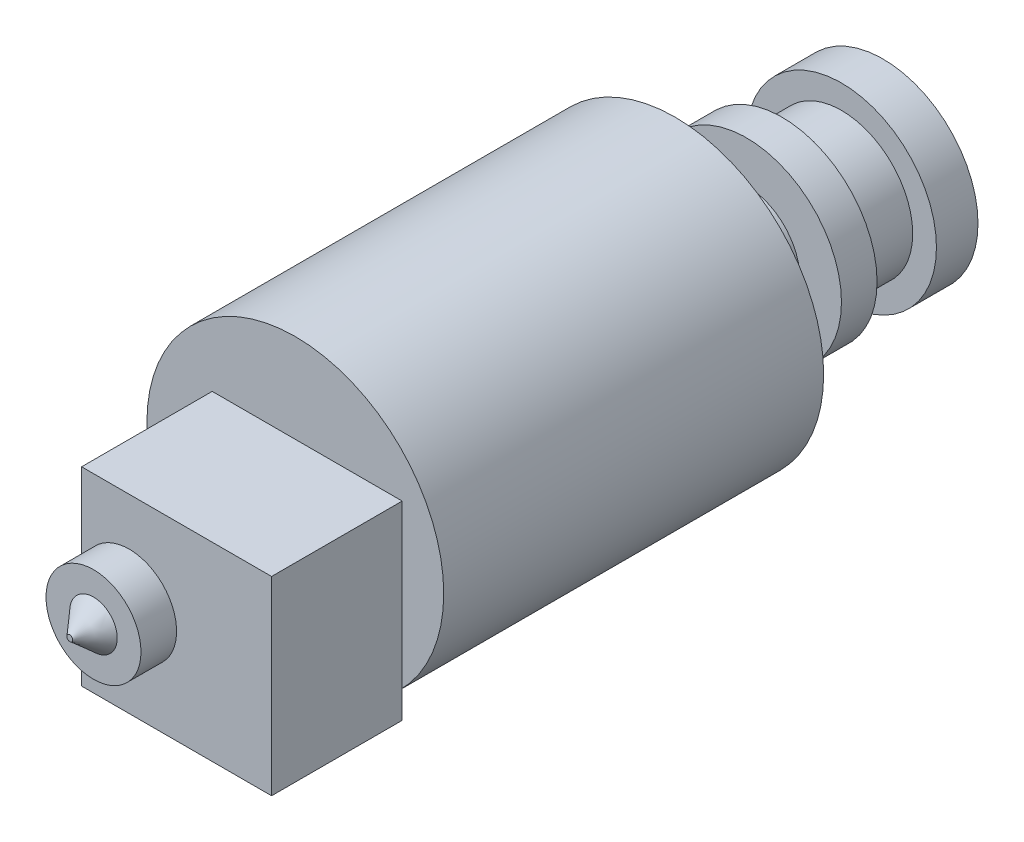
ISO-10303-21;
HEADER;
FILE_DESCRIPTION(('STEP AP214'),'2;1');
FILE_NAME('part.step','',(''),(''),'','','');
FILE_SCHEMA(('AUTOMOTIVE_DESIGN { 1 0 10303 214 1 1 1 1 }'));
ENDSEC;
DATA;
#1=APPLICATION_CONTEXT('core data for automotive mechanical design processes');
#2=APPLICATION_PROTOCOL_DEFINITION('international standard','automotive_design',2000,#1);
#3=PRODUCT_CONTEXT('',#1,'mechanical');
#4=PRODUCT('Part','Part','',(#3));
#5=PRODUCT_RELATED_PRODUCT_CATEGORY('part','',(#4));
#6=PRODUCT_DEFINITION_FORMATION('','',#4);
#7=PRODUCT_DEFINITION_CONTEXT('part definition',#1,'design');
#8=PRODUCT_DEFINITION('design','',#6,#7);
#9=PRODUCT_DEFINITION_SHAPE('','',#8);
#10=(LENGTH_UNIT() NAMED_UNIT(*) SI_UNIT(.MILLI.,.METRE.));
#11=(NAMED_UNIT(*) PLANE_ANGLE_UNIT() SI_UNIT($,.RADIAN.));
#12=(NAMED_UNIT(*) SI_UNIT($,.STERADIAN.) SOLID_ANGLE_UNIT());
#13=UNCERTAINTY_MEASURE_WITH_UNIT(LENGTH_MEASURE(1.E-05),#10,'distance_accuracy_value','');
#14=(GEOMETRIC_REPRESENTATION_CONTEXT(3) GLOBAL_UNCERTAINTY_ASSIGNED_CONTEXT((#13)) GLOBAL_UNIT_ASSIGNED_CONTEXT((#10,
#11,#12)) REPRESENTATION_CONTEXT('',''));
#15=CARTESIAN_POINT('',(0.,0.,0.));
#16=DIRECTION('',(0.,0.,1.));
#17=DIRECTION('',(1.,0.,0.));
#18=AXIS2_PLACEMENT_3D('',#15,#16,#17);
#19=CARTESIAN_POINT('',(0.,0.,66.5));
#20=DIRECTION('',(0.,0.,1.));
#21=DIRECTION('',(1.,0.,0.));
#22=AXIS2_PLACEMENT_3D('',#19,#20,#21);
#23=PLANE('',#22);
#24=CARTESIAN_POINT('',(0.,0.,66.5));
#25=DIRECTION('',(0.,0.,1.));
#26=DIRECTION('',(1.,0.,0.));
#27=AXIS2_PLACEMENT_3D('',#24,#25,#26);
#28=CIRCLE('',#27,4.);
#29=CARTESIAN_POINT('',(4.,0.,66.5));
#30=VERTEX_POINT('',#29);
#31=EDGE_CURVE('E110',#30,#30,#28,.T.);
#32=ORIENTED_EDGE('',*,*,#31,.T.);
#33=EDGE_LOOP('',(#32));
#34=FACE_BOUND('',#33,.T.);
#35=CARTESIAN_POINT('',(0.,0.,66.5));
#36=DIRECTION('',(0.,0.,1.));
#37=DIRECTION('',(1.,0.,0.));
#38=AXIS2_PLACEMENT_3D('',#35,#36,#37);
#39=CIRCLE('',#38,2.);
#40=CARTESIAN_POINT('',(-1.91917894483876,-0.562807407278518,66.5));
#41=VERTEX_POINT('',#40);
#42=EDGE_CURVE('E428',#41,#41,#39,.T.);
#43=ORIENTED_EDGE('',*,*,#42,.F.);
#44=EDGE_LOOP('',(#43));
#45=FACE_BOUND('',#44,.T.);
#46=ADVANCED_FACE('F37',(#34,#45),#23,.T.);
#47=CARTESIAN_POINT('',(0.,0.,3.5));
#48=DIRECTION('',(0.,0.,-1.));
#49=DIRECTION('',(-1.,0.,0.));
#50=AXIS2_PLACEMENT_3D('',#47,#48,#49);
#51=CYLINDRICAL_SURFACE('',#50,8.);
#52=CARTESIAN_POINT('',(0.,0.,3.5));
#53=DIRECTION('',(0.,0.,1.));
#54=DIRECTION('',(1.,0.,0.));
#55=AXIS2_PLACEMENT_3D('',#52,#53,#54);
#56=CIRCLE('',#55,8.);
#57=CARTESIAN_POINT('',(8.,0.,3.5));
#58=VERTEX_POINT('',#57);
#59=EDGE_CURVE('E12',#58,#58,#56,.T.);
#60=ORIENTED_EDGE('',*,*,#59,.F.);
#61=EDGE_LOOP('',(#60));
#62=FACE_BOUND('',#61,.T.);
#63=CARTESIAN_POINT('',(0.,0.,0.));
#64=DIRECTION('',(0.,0.,1.));
#65=DIRECTION('',(1.,0.,0.));
#66=AXIS2_PLACEMENT_3D('',#63,#64,#65);
#67=CIRCLE('',#66,8.);
#68=CARTESIAN_POINT('',(8.,0.,0.));
#69=VERTEX_POINT('',#68);
#70=EDGE_CURVE('E41',#69,#69,#67,.T.);
#71=ORIENTED_EDGE('',*,*,#70,.T.);
#72=EDGE_LOOP('',(#71));
#73=FACE_BOUND('',#72,.T.);
#74=ADVANCED_FACE('F39',(#62,#73),#51,.T.);
#75=CARTESIAN_POINT('',(0.,0.,3.5));
#76=DIRECTION('',(0.,0.,1.));
#77=DIRECTION('',(1.,0.,0.));
#78=AXIS2_PLACEMENT_3D('',#75,#76,#77);
#79=PLANE('',#78);
#80=CARTESIAN_POINT('',(0.,0.,3.5));
#81=DIRECTION('',(0.,0.,1.));
#82=DIRECTION('',(1.,0.,0.));
#83=AXIS2_PLACEMENT_3D('',#80,#81,#82);
#84=CIRCLE('',#83,6.);
#85=CARTESIAN_POINT('',(6.,0.,3.5));
#86=VERTEX_POINT('',#85);
#87=EDGE_CURVE('E142',#86,#86,#84,.T.);
#88=ORIENTED_EDGE('',*,*,#87,.F.);
#89=EDGE_LOOP('',(#88));
#90=FACE_BOUND('',#89,.T.);
#91=ORIENTED_EDGE('',*,*,#59,.T.);
#92=EDGE_LOOP('',(#91));
#93=FACE_BOUND('',#92,.T.);
#94=ADVANCED_FACE('F153',(#90,#93),#79,.T.);
#95=CARTESIAN_POINT('',(0.,0.,0.));
#96=DIRECTION('',(0.,0.,1.));
#97=DIRECTION('',(1.,0.,0.));
#98=AXIS2_PLACEMENT_3D('',#95,#96,#97);
#99=PLANE('',#98);
#100=CARTESIAN_POINT('',(0.,0.,0.));
#101=DIRECTION('',(0.,0.,-1.));
#102=DIRECTION('',(-1.,0.,0.));
#103=AXIS2_PLACEMENT_3D('',#100,#101,#102);
#104=CIRCLE('',#103,1.5);
#105=CARTESIAN_POINT('',(-1.5,0.,0.));
#106=VERTEX_POINT('',#105);
#107=EDGE_CURVE('E433',#106,#106,#104,.T.);
#108=ORIENTED_EDGE('',*,*,#107,.F.);
#109=EDGE_LOOP('',(#108));
#110=FACE_BOUND('',#109,.T.);
#111=ORIENTED_EDGE('',*,*,#70,.F.);
#112=EDGE_LOOP('',(#111));
#113=FACE_BOUND('',#112,.T.);
#114=ADVANCED_FACE('F156',(#110,#113),#99,.F.);
#115=CARTESIAN_POINT('',(0.,0.,8.5));
#116=DIRECTION('',(0.,0.,-1.));
#117=DIRECTION('',(-1.,0.,0.));
#118=AXIS2_PLACEMENT_3D('',#115,#116,#117);
#119=CYLINDRICAL_SURFACE('',#118,6.);
#120=CARTESIAN_POINT('',(0.,0.,8.5));
#121=DIRECTION('',(0.,0.,1.));
#122=DIRECTION('',(1.,0.,0.));
#123=AXIS2_PLACEMENT_3D('',#120,#121,#122);
#124=CIRCLE('',#123,6.);
#125=CARTESIAN_POINT('',(6.,0.,8.5));
#126=VERTEX_POINT('',#125);
#127=EDGE_CURVE('E145',#126,#126,#124,.T.);
#128=ORIENTED_EDGE('',*,*,#127,.F.);
#129=EDGE_LOOP('',(#128));
#130=FACE_BOUND('',#129,.T.);
#131=ORIENTED_EDGE('',*,*,#87,.T.);
#132=EDGE_LOOP('',(#131));
#133=FACE_BOUND('',#132,.T.);
#134=ADVANCED_FACE('F151',(#130,#133),#119,.T.);
#135=CARTESIAN_POINT('',(0.,0.,11.5));
#136=DIRECTION('',(0.,0.,-1.));
#137=DIRECTION('',(-1.,0.,0.));
#138=AXIS2_PLACEMENT_3D('',#135,#136,#137);
#139=CYLINDRICAL_SURFACE('',#138,8.);
#140=CARTESIAN_POINT('',(0.,0.,11.5));
#141=DIRECTION('',(0.,0.,1.));
#142=DIRECTION('',(1.,0.,0.));
#143=AXIS2_PLACEMENT_3D('',#140,#141,#142);
#144=CIRCLE('',#143,8.);
#145=CARTESIAN_POINT('',(8.,0.,11.5));
#146=VERTEX_POINT('',#145);
#147=EDGE_CURVE('E139',#146,#146,#144,.T.);
#148=ORIENTED_EDGE('',*,*,#147,.F.);
#149=EDGE_LOOP('',(#148));
#150=FACE_BOUND('',#149,.T.);
#151=CARTESIAN_POINT('',(0.,0.,8.5));
#152=DIRECTION('',(0.,0.,1.));
#153=DIRECTION('',(1.,0.,0.));
#154=AXIS2_PLACEMENT_3D('',#151,#152,#153);
#155=CIRCLE('',#154,8.);
#156=CARTESIAN_POINT('',(8.,0.,8.5));
#157=VERTEX_POINT('',#156);
#158=EDGE_CURVE('E136',#157,#157,#155,.T.);
#159=ORIENTED_EDGE('',*,*,#158,.T.);
#160=EDGE_LOOP('',(#159));
#161=FACE_BOUND('',#160,.T.);
#162=ADVANCED_FACE('F170',(#150,#161),#139,.T.);
#163=CARTESIAN_POINT('',(0.,0.,11.5));
#164=DIRECTION('',(0.,0.,1.));
#165=DIRECTION('',(1.,0.,0.));
#166=AXIS2_PLACEMENT_3D('',#163,#164,#165);
#167=PLANE('',#166);
#168=CARTESIAN_POINT('',(0.,0.,11.5));
#169=DIRECTION('',(0.,0.,1.));
#170=DIRECTION('',(1.,0.,0.));
#171=AXIS2_PLACEMENT_3D('',#168,#169,#170);
#172=CIRCLE('',#171,4.5);
#173=CARTESIAN_POINT('',(4.5,0.,11.5));
#174=VERTEX_POINT('',#173);
#175=EDGE_CURVE('E130',#174,#174,#172,.T.);
#176=ORIENTED_EDGE('',*,*,#175,.F.);
#177=EDGE_LOOP('',(#176));
#178=FACE_BOUND('',#177,.T.);
#179=ORIENTED_EDGE('',*,*,#147,.T.);
#180=EDGE_LOOP('',(#179));
#181=FACE_BOUND('',#180,.T.);
#182=ADVANCED_FACE('F228',(#178,#181),#167,.T.);
#183=CARTESIAN_POINT('',(0.,0.,8.5));
#184=DIRECTION('',(0.,0.,1.));
#185=DIRECTION('',(1.,0.,0.));
#186=AXIS2_PLACEMENT_3D('',#183,#184,#185);
#187=PLANE('',#186);
#188=ORIENTED_EDGE('',*,*,#127,.T.);
#189=EDGE_LOOP('',(#188));
#190=FACE_BOUND('',#189,.T.);
#191=ORIENTED_EDGE('',*,*,#158,.F.);
#192=EDGE_LOOP('',(#191));
#193=FACE_BOUND('',#192,.T.);
#194=ADVANCED_FACE('F226',(#190,#193),#187,.F.);
#195=CARTESIAN_POINT('',(0.,0.,17.5));
#196=DIRECTION('',(0.,0.,-1.));
#197=DIRECTION('',(-1.,0.,0.));
#198=AXIS2_PLACEMENT_3D('',#195,#196,#197);
#199=CYLINDRICAL_SURFACE('',#198,4.5);
#200=CARTESIAN_POINT('',(0.,0.,17.5));
#201=DIRECTION('',(0.,0.,1.));
#202=DIRECTION('',(1.,0.,0.));
#203=AXIS2_PLACEMENT_3D('',#200,#201,#202);
#204=CIRCLE('',#203,4.5);
#205=CARTESIAN_POINT('',(4.5,0.,17.5));
#206=VERTEX_POINT('',#205);
#207=EDGE_CURVE('E133',#206,#206,#204,.T.);
#208=ORIENTED_EDGE('',*,*,#207,.F.);
#209=EDGE_LOOP('',(#208));
#210=FACE_BOUND('',#209,.T.);
#211=ORIENTED_EDGE('',*,*,#175,.T.);
#212=EDGE_LOOP('',(#211));
#213=FACE_BOUND('',#212,.T.);
#214=ADVANCED_FACE('F222',(#210,#213),#199,.T.);
#215=CARTESIAN_POINT('',(0.,0.,49.5));
#216=DIRECTION('',(0.,0.,-1.));
#217=DIRECTION('',(-1.,0.,0.));
#218=AXIS2_PLACEMENT_3D('',#215,#216,#217);
#219=CYLINDRICAL_SURFACE('',#218,12.5);
#220=CARTESIAN_POINT('',(0.,0.,49.5));
#221=DIRECTION('',(0.,0.,1.));
#222=DIRECTION('',(1.,0.,0.));
#223=AXIS2_PLACEMENT_3D('',#220,#221,#222);
#224=CIRCLE('',#223,12.5);
#225=CARTESIAN_POINT('',(12.5,0.,49.5));
#226=VERTEX_POINT('',#225);
#227=EDGE_CURVE('E127',#226,#226,#224,.T.);
#228=ORIENTED_EDGE('',*,*,#227,.F.);
#229=EDGE_LOOP('',(#228));
#230=FACE_BOUND('',#229,.T.);
#231=CARTESIAN_POINT('',(0.,0.,17.5));
#232=DIRECTION('',(0.,0.,1.));
#233=DIRECTION('',(1.,0.,0.));
#234=AXIS2_PLACEMENT_3D('',#231,#232,#233);
#235=CIRCLE('',#234,12.5);
#236=CARTESIAN_POINT('',(12.5,0.,17.5));
#237=VERTEX_POINT('',#236);
#238=EDGE_CURVE('E124',#237,#237,#235,.T.);
#239=ORIENTED_EDGE('',*,*,#238,.T.);
#240=EDGE_LOOP('',(#239));
#241=FACE_BOUND('',#240,.T.);
#242=ADVANCED_FACE('F215',(#230,#241),#219,.T.);
#243=CARTESIAN_POINT('',(0.,0.,49.5));
#244=DIRECTION('',(0.,0.,1.));
#245=DIRECTION('',(1.,0.,0.));
#246=AXIS2_PLACEMENT_3D('',#243,#244,#245);
#247=PLANE('',#246);
#248=CARTESIAN_POINT('',(0.,0.,49.5));
#249=DIRECTION('',(0.,0.,1.));
#250=DIRECTION('',(1.,0.,0.));
#251=AXIS2_PLACEMENT_3D('',#248,#249,#250);
#252=CIRCLE('',#251,3.);
#253=CARTESIAN_POINT('',(3.,0.,49.5));
#254=VERTEX_POINT('',#253);
#255=EDGE_CURVE('E120',#254,#254,#252,.T.);
#256=ORIENTED_EDGE('',*,*,#255,.F.);
#257=EDGE_LOOP('',(#256));
#258=FACE_BOUND('',#257,.T.);
#259=ORIENTED_EDGE('',*,*,#227,.T.);
#260=EDGE_LOOP('',(#259));
#261=FACE_BOUND('',#260,.T.);
#262=ADVANCED_FACE('F212',(#258,#261),#247,.T.);
#263=CARTESIAN_POINT('',(0.,0.,17.5));
#264=DIRECTION('',(0.,0.,1.));
#265=DIRECTION('',(1.,0.,0.));
#266=AXIS2_PLACEMENT_3D('',#263,#264,#265);
#267=PLANE('',#266);
#268=ORIENTED_EDGE('',*,*,#207,.T.);
#269=EDGE_LOOP('',(#268));
#270=FACE_BOUND('',#269,.T.);
#271=ORIENTED_EDGE('',*,*,#238,.F.);
#272=EDGE_LOOP('',(#271));
#273=FACE_BOUND('',#272,.T.);
#274=ADVANCED_FACE('F210',(#270,#273),#267,.F.);
#275=CARTESIAN_POINT('',(0.,0.,52.5));
#276=DIRECTION('',(0.,0.,-1.));
#277=DIRECTION('',(-1.,0.,0.));
#278=AXIS2_PLACEMENT_3D('',#275,#276,#277);
#279=CYLINDRICAL_SURFACE('',#278,3.);
#280=CARTESIAN_POINT('',(0.,0.,52.5));
#281=DIRECTION('',(0.,0.,1.));
#282=DIRECTION('',(1.,0.,0.));
#283=AXIS2_PLACEMENT_3D('',#280,#281,#282);
#284=CIRCLE('',#283,3.);
#285=CARTESIAN_POINT('',(3.,0.,52.5));
#286=VERTEX_POINT('',#285);
#287=EDGE_CURVE('E121',#286,#286,#284,.T.);
#288=ORIENTED_EDGE('',*,*,#287,.F.);
#289=EDGE_LOOP('',(#288));
#290=FACE_BOUND('',#289,.T.);
#291=ORIENTED_EDGE('',*,*,#255,.T.);
#292=EDGE_LOOP('',(#291));
#293=FACE_BOUND('',#292,.T.);
#294=ADVANCED_FACE('F206',(#290,#293),#279,.T.);
#295=CARTESIAN_POINT('',(12.,-8.,63.5));
#296=DIRECTION('',(-1.,0.,0.));
#297=DIRECTION('',(0.,0.,1.));
#298=AXIS2_PLACEMENT_3D('',#295,#296,#297);
#299=PLANE('',#298);
#300=DIRECTION('',(0.,1.,0.));
#301=VECTOR('',#300,1.);
#302=CARTESIAN_POINT('',(12.,-8.,52.5));
#303=LINE('',#302,#301);
#304=CARTESIAN_POINT('',(12.,-8.,52.5));
#305=VERTEX_POINT('',#304);
#306=CARTESIAN_POINT('',(12.,8.,52.5));
#307=VERTEX_POINT('',#306);
#308=EDGE_CURVE('E106',#305,#307,#303,.T.);
#309=ORIENTED_EDGE('',*,*,#308,.T.);
#310=DIRECTION('',(0.,0.,-1.));
#311=VECTOR('',#310,1.);
#312=CARTESIAN_POINT('',(12.,8.,63.5));
#313=LINE('',#312,#311);
#314=CARTESIAN_POINT('',(12.,8.,63.5));
#315=VERTEX_POINT('',#314);
#316=EDGE_CURVE('E118',#315,#307,#313,.T.);
#317=ORIENTED_EDGE('',*,*,#316,.F.);
#318=DIRECTION('',(0.,1.,0.));
#319=VECTOR('',#318,1.);
#320=CARTESIAN_POINT('',(12.,-8.,63.5));
#321=LINE('',#320,#319);
#322=CARTESIAN_POINT('',(12.,-8.,63.5));
#323=VERTEX_POINT('',#322);
#324=EDGE_CURVE('E100',#323,#315,#321,.T.);
#325=ORIENTED_EDGE('',*,*,#324,.F.);
#326=DIRECTION('',(0.,0.,-1.));
#327=VECTOR('',#326,1.);
#328=CARTESIAN_POINT('',(12.,-8.,63.5));
#329=LINE('',#328,#327);
#330=EDGE_CURVE('E105',#323,#305,#329,.T.);
#331=ORIENTED_EDGE('',*,*,#330,.T.);
#332=EDGE_LOOP('',(#309,#317,#325,#331));
#333=FACE_BOUND('',#332,.T.);
#334=ADVANCED_FACE('F203',(#333),#299,.F.);
#335=CARTESIAN_POINT('',(-4.,8.,63.5));
#336=DIRECTION('',(0.,-1.,0.));
#337=DIRECTION('',(0.,0.,-1.));
#338=AXIS2_PLACEMENT_3D('',#335,#336,#337);
#339=PLANE('',#338);
#340=DIRECTION('',(-1.,0.,0.));
#341=VECTOR('',#340,1.);
#342=CARTESIAN_POINT('',(-4.,8.,52.5));
#343=LINE('',#342,#341);
#344=CARTESIAN_POINT('',(-4.,8.,52.5));
#345=VERTEX_POINT('',#344);
#346=EDGE_CURVE('E109',#307,#345,#343,.T.);
#347=ORIENTED_EDGE('',*,*,#346,.T.);
#348=DIRECTION('',(0.,0.,-1.));
#349=VECTOR('',#348,1.);
#350=CARTESIAN_POINT('',(-4.,8.,63.5));
#351=LINE('',#350,#349);
#352=CARTESIAN_POINT('',(-4.,8.,63.5));
#353=VERTEX_POINT('',#352);
#354=EDGE_CURVE('E116',#353,#345,#351,.T.);
#355=ORIENTED_EDGE('',*,*,#354,.F.);
#356=DIRECTION('',(-1.,0.,0.));
#357=VECTOR('',#356,1.);
#358=CARTESIAN_POINT('',(-4.,8.,63.5));
#359=LINE('',#358,#357);
#360=EDGE_CURVE('E86',#315,#353,#359,.T.);
#361=ORIENTED_EDGE('',*,*,#360,.F.);
#362=ORIENTED_EDGE('',*,*,#316,.T.);
#363=EDGE_LOOP('',(#347,#355,#361,#362));
#364=FACE_BOUND('',#363,.T.);
#365=ADVANCED_FACE('F200',(#364),#339,.F.);
#366=CARTESIAN_POINT('',(-4.,-8.,63.5));
#367=DIRECTION('',(1.,0.,0.));
#368=DIRECTION('',(0.,0.,-1.));
#369=AXIS2_PLACEMENT_3D('',#366,#367,#368);
#370=PLANE('',#369);
#371=DIRECTION('',(0.,-1.,0.));
#372=VECTOR('',#371,1.);
#373=CARTESIAN_POINT('',(-4.,-8.,52.5));
#374=LINE('',#373,#372);
#375=CARTESIAN_POINT('',(-4.,-8.,52.5));
#376=VERTEX_POINT('',#375);
#377=EDGE_CURVE('E72',#345,#376,#374,.T.);
#378=ORIENTED_EDGE('',*,*,#377,.T.);
#379=DIRECTION('',(0.,0.,-1.));
#380=VECTOR('',#379,1.);
#381=CARTESIAN_POINT('',(-4.,-8.,63.5));
#382=LINE('',#381,#380);
#383=CARTESIAN_POINT('',(-4.,-8.,63.5));
#384=VERTEX_POINT('',#383);
#385=EDGE_CURVE('E99',#384,#376,#382,.T.);
#386=ORIENTED_EDGE('',*,*,#385,.F.);
#387=DIRECTION('',(0.,-1.,0.));
#388=VECTOR('',#387,1.);
#389=CARTESIAN_POINT('',(-4.,-8.,63.5));
#390=LINE('',#389,#388);
#391=CARTESIAN_POINT('',(-4.,0.,63.5));
#392=VERTEX_POINT('',#391);
#393=EDGE_CURVE('E96',#392,#384,#390,.T.);
#394=ORIENTED_EDGE('',*,*,#393,.F.);
#395=EDGE_CURVE('E91',#353,#392,#390,.T.);
#396=ORIENTED_EDGE('',*,*,#395,.F.);
#397=ORIENTED_EDGE('',*,*,#354,.T.);
#398=EDGE_LOOP('',(#378,#386,#394,#396,#397));
#399=FACE_BOUND('',#398,.T.);
#400=ADVANCED_FACE('F98',(#399),#370,.F.);
#401=CARTESIAN_POINT('',(-4.,-8.,63.5));
#402=DIRECTION('',(0.,1.,0.));
#403=DIRECTION('',(0.,0.,1.));
#404=AXIS2_PLACEMENT_3D('',#401,#402,#403);
#405=PLANE('',#404);
#406=DIRECTION('',(1.,0.,0.));
#407=VECTOR('',#406,1.);
#408=CARTESIAN_POINT('',(-4.,-8.,52.5));
#409=LINE('',#408,#407);
#410=EDGE_CURVE('E78',#376,#305,#409,.T.);
#411=ORIENTED_EDGE('',*,*,#410,.T.);
#412=ORIENTED_EDGE('',*,*,#330,.F.);
#413=DIRECTION('',(1.,0.,0.));
#414=VECTOR('',#413,1.);
#415=CARTESIAN_POINT('',(-4.,-8.,63.5));
#416=LINE('',#415,#414);
#417=EDGE_CURVE('E54',#384,#323,#416,.T.);
#418=ORIENTED_EDGE('',*,*,#417,.F.);
#419=ORIENTED_EDGE('',*,*,#385,.T.);
#420=EDGE_LOOP('',(#411,#412,#418,#419));
#421=FACE_BOUND('',#420,.T.);
#422=ADVANCED_FACE('F192',(#421),#405,.F.);
#423=CARTESIAN_POINT('',(0.,0.,63.5));
#424=DIRECTION('',(0.,0.,-1.));
#425=DIRECTION('',(-1.,0.,0.));
#426=AXIS2_PLACEMENT_3D('',#423,#424,#425);
#427=PLANE('',#426);
#428=ORIENTED_EDGE('',*,*,#395,.T.);
#429=CARTESIAN_POINT('',(0.,0.,63.5));
#430=DIRECTION('',(0.,0.,1.));
#431=DIRECTION('',(1.,0.,0.));
#432=AXIS2_PLACEMENT_3D('',#429,#430,#431);
#433=CIRCLE('',#432,4.);
#434=EDGE_CURVE('E95',#392,#392,#433,.T.);
#435=ORIENTED_EDGE('',*,*,#434,.F.);
#436=ORIENTED_EDGE('',*,*,#393,.T.);
#437=ORIENTED_EDGE('',*,*,#417,.T.);
#438=ORIENTED_EDGE('',*,*,#324,.T.);
#439=ORIENTED_EDGE('',*,*,#360,.T.);
#440=EDGE_LOOP('',(#428,#435,#436,#437,#438,#439));
#441=FACE_BOUND('',#440,.T.);
#442=ADVANCED_FACE('F93',(#441),#427,.F.);
#443=CARTESIAN_POINT('',(0.,0.,52.5));
#444=DIRECTION('',(0.,0.,-1.));
#445=DIRECTION('',(-1.,0.,0.));
#446=AXIS2_PLACEMENT_3D('',#443,#444,#445);
#447=PLANE('',#446);
#448=ORIENTED_EDGE('',*,*,#287,.T.);
#449=EDGE_LOOP('',(#448));
#450=FACE_BOUND('',#449,.T.);
#451=ORIENTED_EDGE('',*,*,#308,.F.);
#452=ORIENTED_EDGE('',*,*,#410,.F.);
#453=ORIENTED_EDGE('',*,*,#377,.F.);
#454=ORIENTED_EDGE('',*,*,#346,.F.);
#455=EDGE_LOOP('',(#451,#452,#453,#454));
#456=FACE_BOUND('',#455,.T.);
#457=ADVANCED_FACE('F188',(#450,#456),#447,.T.);
#458=CARTESIAN_POINT('',(0.,0.,66.5));
#459=DIRECTION('',(0.,0.,-1.));
#460=DIRECTION('',(-1.,0.,0.));
#461=AXIS2_PLACEMENT_3D('',#458,#459,#460);
#462=CYLINDRICAL_SURFACE('',#461,4.);
#463=ORIENTED_EDGE('',*,*,#31,.F.);
#464=EDGE_LOOP('',(#463));
#465=FACE_BOUND('',#464,.T.);
#466=ORIENTED_EDGE('',*,*,#434,.T.);
#467=EDGE_LOOP('',(#466));
#468=FACE_BOUND('',#467,.T.);
#469=ADVANCED_FACE('F185',(#465,#468),#462,.T.);
#470=CARTESIAN_POINT('',(0.,0.,2.));
#471=DIRECTION('',(0.,0.,-1.));
#472=DIRECTION('',(-1.,0.,0.));
#473=AXIS2_PLACEMENT_3D('',#470,#471,#472);
#474=CYLINDRICAL_SURFACE('',#473,1.5);
#475=CARTESIAN_POINT('',(0.,0.,2.));
#476=DIRECTION('',(0.,0.,-1.));
#477=DIRECTION('',(-1.,0.,0.));
#478=AXIS2_PLACEMENT_3D('',#475,#476,#477);
#479=CIRCLE('',#478,1.5);
#480=CARTESIAN_POINT('',(-1.5,0.,2.));
#481=VERTEX_POINT('',#480);
#482=EDGE_CURVE('E434',#481,#481,#479,.T.);
#483=ORIENTED_EDGE('',*,*,#482,.F.);
#484=EDGE_LOOP('',(#483));
#485=FACE_BOUND('',#484,.T.);
#486=ORIENTED_EDGE('',*,*,#107,.T.);
#487=EDGE_LOOP('',(#486));
#488=FACE_BOUND('',#487,.T.);
#489=ADVANCED_FACE('F183',(#485,#488),#474,.F.);
#490=CARTESIAN_POINT('',(0.,0.,2.));
#491=DIRECTION('',(0.,0.,-1.));
#492=DIRECTION('',(-1.,0.,0.));
#493=AXIS2_PLACEMENT_3D('',#490,#491,#492);
#494=PLANE('',#493);
#495=ORIENTED_EDGE('',*,*,#482,.T.);
#496=EDGE_LOOP('',(#495));
#497=FACE_BOUND('',#496,.T.);
#498=ADVANCED_FACE('F308',(#497),#494,.T.);
#499=CARTESIAN_POINT('',(0.,0.,68.5));
#500=DIRECTION('',(0.,0.,1.));
#501=DIRECTION('',(1.,0.,0.));
#502=AXIS2_PLACEMENT_3D('',#499,#500,#501);
#503=PLANE('',#502);
#504=CARTESIAN_POINT('',(0.,0.,68.5));
#505=DIRECTION('',(0.,0.,1.));
#506=DIRECTION('',(1.,0.,0.));
#507=AXIS2_PLACEMENT_3D('',#504,#505,#506);
#508=CIRCLE('',#507,0.25);
#509=CARTESIAN_POINT('',(-0.247162936184479,0.0375563972801892,68.5));
#510=VERTEX_POINT('',#509);
#511=EDGE_CURVE('E418',#510,#510,#508,.T.);
#512=ORIENTED_EDGE('',*,*,#511,.T.);
#513=EDGE_LOOP('',(#512));
#514=FACE_BOUND('',#513,.T.);
#515=ADVANCED_FACE('F315',(#514),#503,.T.);
#516=CARTESIAN_POINT('',(-0.247162936184479,0.0375563972801892,68.5));
#517=CARTESIAN_POINT('',(-1.91917894483876,-0.562807407278518,66.5));
#518=CARTESIAN_POINT('',(-0.1720501416241,0.531882269649146,68.5));
#519=CARTESIAN_POINT('',(-3.0447937593958,3.27555048239901,66.5));
#520=CARTESIAN_POINT('',(0.322275730744857,0.456769475088768,68.5));
#521=CARTESIAN_POINT('',(0.793564130281727,4.40116529695605,66.5));
#522=CARTESIAN_POINT('',(0.247162936184479,-0.0375563972801892,68.5));
#523=CARTESIAN_POINT('',(1.91917894483876,0.562807407278519,66.5));
#524=CARTESIAN_POINT('',(0.1720501416241,-0.531882269649146,68.5));
#525=CARTESIAN_POINT('',(3.0447937593958,-3.27555048239901,66.5));
#526=CARTESIAN_POINT('',(-0.322275730744857,-0.456769475088768,68.5));
#527=CARTESIAN_POINT('',(-0.793564130281726,-4.40116529695605,66.5));
#528=CARTESIAN_POINT('',(-0.247162936184479,0.0375563972801892,68.5));
#529=CARTESIAN_POINT('',(-1.91917894483876,-0.562807407278518,66.5));
#530=(BOUNDED_SURFACE() B_SPLINE_SURFACE(3,1,((#516,#517),(#518,#519),(#520,#521),(#522,#523),
(#524,#525),(#526,#527),(#528,#529)),.UNSPECIFIED.,.T.,.F.,.F.) B_SPLINE_SURFACE_WITH_KNOTS((4,
3,4),(2,2),(0.,0.5,1.),(0.,1.),
.UNSPECIFIED.) GEOMETRIC_REPRESENTATION_ITEM() RATIONAL_B_SPLINE_SURFACE(((1.,1.),
(0.333333333333333,0.333333333333333),(0.333333333333333,0.333333333333333),(1.,1.),
(0.333333333333333,0.333333333333334),(0.333333333333333,0.333333333333334),(1.,1.))) REPRESENTATION_ITEM('') SURFACE());
#531=CARTESIAN_POINT('',(-0.247162936184479,0.0375563972801892,68.5));
#532=CARTESIAN_POINT('',(-0.264579769607957,0.0313026076493705,68.4791666666667));
#533=CARTESIAN_POINT('',(-0.281996603031441,0.0250488180185502,68.4583333333333));
#534=CARTESIAN_POINT('',(-0.316830269878407,0.0125412387569096,68.4166666666667));
#535=CARTESIAN_POINT('',(-0.334247103301891,0.00628744912608935,68.3958333333333));
#536=CARTESIAN_POINT('',(-0.369080770148854,-0.00622013013555024,68.3541666666667));
#537=CARTESIAN_POINT('',(-0.386497603572335,-0.0124739197663695,68.3333333333333));
#538=CARTESIAN_POINT('',(-0.421331270419299,-0.024981499028009,68.2916666666667));
#539=CARTESIAN_POINT('',(-0.438748103842781,-0.0312352886588292,68.2708333333333));
#540=CARTESIAN_POINT('',(-0.473581770689747,-0.0437428679204694,68.2291666666667));
#541=CARTESIAN_POINT('',(-0.49099860411323,-0.0499966575512894,68.2083333333333));
#542=CARTESIAN_POINT('',(-0.525832270960194,-0.0625042368129291,68.1666666666667));
#543=CARTESIAN_POINT('',(-0.543249104383676,-0.0687580264437488,68.1458333333333));
#544=CARTESIAN_POINT('',(-0.578082771230639,-0.0812656057053882,68.1041666666667));
#545=CARTESIAN_POINT('',(-0.59549960465412,-0.0875193953362079,68.0833333333333));
#546=CARTESIAN_POINT('',(-0.630333271501085,-0.100026974597848,68.0416666666667));
#547=CARTESIAN_POINT('',(-0.647750104924567,-0.106280764228668,68.0208333333333));
#548=CARTESIAN_POINT('',(-0.682583771771533,-0.118788343490308,67.9791666666667));
#549=CARTESIAN_POINT('',(-0.700000605195015,-0.125042133121128,67.9583333333333));
#550=CARTESIAN_POINT('',(-0.734834272041979,-0.137549712382768,67.9166666666667));
#551=CARTESIAN_POINT('',(-0.752251105465461,-0.143803502013587,67.8958333333333));
#552=CARTESIAN_POINT('',(-0.787084772312424,-0.156311081275227,67.8541666666667));
#553=CARTESIAN_POINT('',(-0.804501605735906,-0.162564870906046,67.8333333333333));
#554=CARTESIAN_POINT('',(-0.83933527258287,-0.175072450167686,67.7916666666667));
#555=CARTESIAN_POINT('',(-0.856752106006353,-0.181326239798506,67.7708333333333));
#556=CARTESIAN_POINT('',(-0.891585772853318,-0.193833819060146,67.7291666666667));
#557=CARTESIAN_POINT('',(-0.909002606276801,-0.200087608690966,67.7083333333333));
#558=CARTESIAN_POINT('',(-0.943836273123765,-0.212595187952606,67.6666666666667));
#559=CARTESIAN_POINT('',(-0.961253106547247,-0.218848977583426,67.6458333333333));
#560=CARTESIAN_POINT('',(-0.99608677339421,-0.231356556845065,67.6041666666667));
#561=CARTESIAN_POINT('',(-1.01350360681769,-0.237610346475885,67.5833333333333));
#562=CARTESIAN_POINT('',(-1.04833727366466,-0.250117925737525,67.5416666666667));
#563=CARTESIAN_POINT('',(-1.06575410708814,-0.256371715368345,67.5208333333333));
#564=CARTESIAN_POINT('',(-1.1005877739351,-0.268879294629985,67.4791666666667));
#565=CARTESIAN_POINT('',(-1.11800460735859,-0.275133084260805,67.4583333333333));
#566=CARTESIAN_POINT('',(-1.15283827420555,-0.287640663522445,67.4166666666667));
#567=CARTESIAN_POINT('',(-1.17025510762903,-0.293894453153264,67.3958333333333));
#568=CARTESIAN_POINT('',(-1.205088774476,-0.306402032414904,67.3541666666667));
#569=CARTESIAN_POINT('',(-1.22250560789948,-0.312655822045723,67.3333333333333));
#570=CARTESIAN_POINT('',(-1.25733927474644,-0.325163401307363,67.2916666666667));
#571=CARTESIAN_POINT('',(-1.27475610816992,-0.331417190938183,67.2708333333333));
#572=CARTESIAN_POINT('',(-1.30958977501689,-0.343924770199823,67.2291666666667));
#573=CARTESIAN_POINT('',(-1.32700660844037,-0.350178559830643,67.2083333333333));
#574=CARTESIAN_POINT('',(-1.36184027528734,-0.362686139092283,67.1666666666667));
#575=CARTESIAN_POINT('',(-1.37925710871082,-0.368939928723103,67.1458333333333));
#576=CARTESIAN_POINT('',(-1.41409077555778,-0.381447507984742,67.1041666666667));
#577=CARTESIAN_POINT('',(-1.43150760898126,-0.387701297615562,67.0833333333333));
#578=CARTESIAN_POINT('',(-1.46634127582823,-0.400208876877201,67.0416666666667));
#579=CARTESIAN_POINT('',(-1.48375810925171,-0.406462666508021,67.0208333333333));
#580=CARTESIAN_POINT('',(-1.51859177609868,-0.418970245769662,66.9791666666667));
#581=CARTESIAN_POINT('',(-1.53600860952216,-0.425224035400482,66.9583333333333));
#582=CARTESIAN_POINT('',(-1.57084227636912,-0.437731614662121,66.9166666666667));
#583=CARTESIAN_POINT('',(-1.5882591097926,-0.443985404292941,66.8958333333333));
#584=CARTESIAN_POINT('',(-1.62309277663957,-0.45649298355458,66.8541666666667));
#585=CARTESIAN_POINT('',(-1.64050961006305,-0.4627467731854,66.8333333333333));
#586=CARTESIAN_POINT('',(-1.67534327691001,-0.47525435244704,66.7916666666667));
#587=CARTESIAN_POINT('',(-1.6927601103335,-0.48150814207786,66.7708333333333));
#588=CARTESIAN_POINT('',(-1.72759377718046,-0.4940157213395,66.7291666666667));
#589=CARTESIAN_POINT('',(-1.74501061060394,-0.50026951097032,66.7083333333333));
#590=CARTESIAN_POINT('',(-1.77984427745091,-0.51277709023196,66.6666666666667));
#591=CARTESIAN_POINT('',(-1.79726111087439,-0.51903087986278,66.6458333333333));
#592=CARTESIAN_POINT('',(-1.83209477772135,-0.531538459124419,66.6041666666667));
#593=CARTESIAN_POINT('',(-1.84951161114483,-0.537792248755239,66.5833333333333));
#594=CARTESIAN_POINT('',(-1.8843452779918,-0.550299828016878,66.5416666666667));
#595=CARTESIAN_POINT('',(-1.90176211141528,-0.556553617647698,66.5208333333333));
#596=CARTESIAN_POINT('',(-1.91917894483876,-0.562807407278518,66.5));
#597=B_SPLINE_CURVE_WITH_KNOTS('',3,(#531,#532,#533,#534,#535,#536,#537,#538,#539,#540,#541,
#542,#543,#544,#545,#546,#547,#548,#549,#550,#551,#552,#553,#554,#555,#556,#557,#558,#559,#560,
#561,#562,#563,#564,#565,#566,#567,#568,#569,#570,#571,#572,#573,#574,#575,#576,#577,#578,#579,
#580,#581,#582,#583,#584,#585,#586,#587,#588,#589,#590,#591,#592,#593,#594,#595,#596),
.UNSPECIFIED.,.F.,.F.,(4,2,2,2,2,2,2,2,2,2,2,2,2,2,2,2,2,2,2,2,2,2,2,2,2,2,2,2,2,2,2,2,4),(0.,
0.0835963739717923,0.167192747943574,0.250789121915366,0.334385495887148,0.41798186985893,
0.501578243830722,0.585174617802515,0.668770991774297,0.752367365746078,0.835963739717871,
0.919560113689663,1.00315648766144,1.08675286163323,1.17034923560502,1.25394560957681,
1.33754198354859,1.42113835752038,1.50473473149217,1.58833110546396,1.67192747943574,
1.75552385340752,1.83912022737932,1.92271660135111,2.00631297532289,2.08990934929467,
2.17350572326646,2.25710209723826,2.34069847121004,2.42429484518182,2.50789121915361,
2.59148759312541,2.67508396709719),.UNSPECIFIED.);
#598=EDGE_CURVE('BSEAM322',#510,#41,#597,.T.);
#599=ORIENTED_EDGE('',*,*,#511,.F.);
#600=ORIENTED_EDGE('',*,*,#42,.T.);
#601=ORIENTED_EDGE('',*,*,#598,.T.);
#602=ORIENTED_EDGE('',*,*,#598,.F.);
#603=EDGE_LOOP('',(#599,#601,#600,#602));
#604=FACE_BOUND('',#603,.T.);
#605=ADVANCED_FACE('F322',(#604),#530,.T.);
#606=CLOSED_SHELL('',(#46,#74,#94,#114,#134,#162,#182,#194,#214,#242,#262,#274,#294,#334,#365,
#400,#422,#442,#457,#469,#489,#498,#515,#605));
#607=MANIFOLD_SOLID_BREP('B2',#606);
#608=ADVANCED_BREP_SHAPE_REPRESENTATION('',(#18,#607),#14);
#609=SHAPE_DEFINITION_REPRESENTATION(#9,#608);
ENDSEC;
END-ISO-10303-21;
